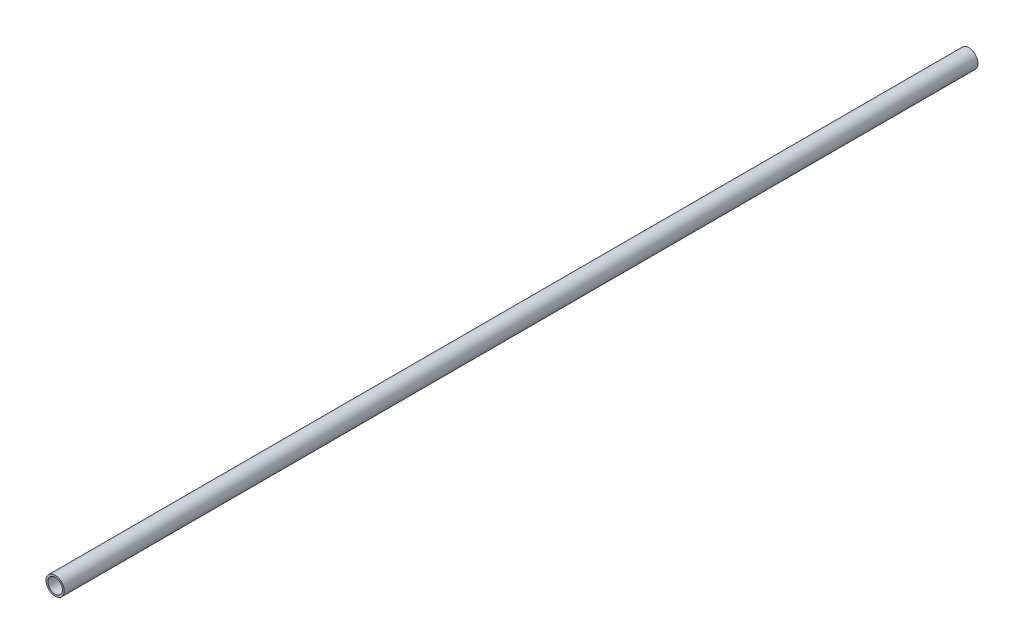
ISO-10303-21;
HEADER;
FILE_DESCRIPTION(('STEP AP214'),'2;1');
FILE_NAME('part.step','',(''),(''),'','','');
FILE_SCHEMA(('AUTOMOTIVE_DESIGN { 1 0 10303 214 1 1 1 1 }'));
ENDSEC;
DATA;
#1=APPLICATION_CONTEXT('core data for automotive mechanical design processes');
#2=APPLICATION_PROTOCOL_DEFINITION('international standard','automotive_design',2000,#1);
#3=PRODUCT_CONTEXT('',#1,'mechanical');
#4=PRODUCT('Part','Part','',(#3));
#5=PRODUCT_RELATED_PRODUCT_CATEGORY('part','',(#4));
#6=PRODUCT_DEFINITION_FORMATION('','',#4);
#7=PRODUCT_DEFINITION_CONTEXT('part definition',#1,'design');
#8=PRODUCT_DEFINITION('design','',#6,#7);
#9=PRODUCT_DEFINITION_SHAPE('','',#8);
#10=(LENGTH_UNIT() NAMED_UNIT(*) SI_UNIT(.MILLI.,.METRE.));
#11=(NAMED_UNIT(*) PLANE_ANGLE_UNIT() SI_UNIT($,.RADIAN.));
#12=(NAMED_UNIT(*) SI_UNIT($,.STERADIAN.) SOLID_ANGLE_UNIT());
#13=UNCERTAINTY_MEASURE_WITH_UNIT(LENGTH_MEASURE(1.E-05),#10,'distance_accuracy_value','');
#14=(GEOMETRIC_REPRESENTATION_CONTEXT(3) GLOBAL_UNCERTAINTY_ASSIGNED_CONTEXT((#13)) GLOBAL_UNIT_ASSIGNED_CONTEXT((#10,
#11,#12)) REPRESENTATION_CONTEXT('',''));
#15=CARTESIAN_POINT('',(0.,0.,0.));
#16=DIRECTION('',(0.,0.,1.));
#17=DIRECTION('',(1.,0.,0.));
#18=AXIS2_PLACEMENT_3D('',#15,#16,#17);
#19=CARTESIAN_POINT('',(0.,0.,2500.));
#20=DIRECTION('',(0.,0.,1.));
#21=DIRECTION('',(1.,0.,0.));
#22=AXIS2_PLACEMENT_3D('',#19,#20,#21);
#23=PLANE('',#22);
#24=CARTESIAN_POINT('',(0.,0.,2500.));
#25=DIRECTION('',(0.,0.,1.));
#26=DIRECTION('',(1.,0.,0.));
#27=AXIS2_PLACEMENT_3D('',#24,#25,#26);
#28=CIRCLE('',#27,25.);
#29=CARTESIAN_POINT('',(25.,0.,2500.));
#30=VERTEX_POINT('',#29);
#31=EDGE_CURVE('E10',#30,#30,#28,.T.);
#32=ORIENTED_EDGE('',*,*,#31,.T.);
#33=EDGE_LOOP('',(#32));
#34=FACE_BOUND('',#33,.T.);
#35=CARTESIAN_POINT('',(0.,0.,2500.));
#36=DIRECTION('',(0.,0.,1.));
#37=DIRECTION('',(1.,0.,0.));
#38=AXIS2_PLACEMENT_3D('',#35,#36,#37);
#39=CIRCLE('',#38,20.);
#40=CARTESIAN_POINT('',(20.,0.,2500.));
#41=VERTEX_POINT('',#40);
#42=EDGE_CURVE('E42',#41,#41,#39,.T.);
#43=ORIENTED_EDGE('',*,*,#42,.F.);
#44=EDGE_LOOP('',(#43));
#45=FACE_BOUND('',#44,.T.);
#46=ADVANCED_FACE('F31',(#34,#45),#23,.T.);
#47=CARTESIAN_POINT('',(0.,0.,0.));
#48=DIRECTION('',(0.,0.,1.));
#49=DIRECTION('',(1.,0.,0.));
#50=AXIS2_PLACEMENT_3D('',#47,#48,#49);
#51=PLANE('',#50);
#52=CARTESIAN_POINT('',(0.,0.,0.));
#53=DIRECTION('',(0.,0.,1.));
#54=DIRECTION('',(1.,0.,0.));
#55=AXIS2_PLACEMENT_3D('',#52,#53,#54);
#56=CIRCLE('',#55,25.);
#57=CARTESIAN_POINT('',(25.,0.,0.));
#58=VERTEX_POINT('',#57);
#59=EDGE_CURVE('E35',#58,#58,#56,.T.);
#60=ORIENTED_EDGE('',*,*,#59,.F.);
#61=EDGE_LOOP('',(#60));
#62=FACE_BOUND('',#61,.T.);
#63=CARTESIAN_POINT('',(0.,0.,0.));
#64=DIRECTION('',(0.,0.,1.));
#65=DIRECTION('',(1.,0.,0.));
#66=AXIS2_PLACEMENT_3D('',#63,#64,#65);
#67=CIRCLE('',#66,20.);
#68=CARTESIAN_POINT('',(20.,0.,0.));
#69=VERTEX_POINT('',#68);
#70=EDGE_CURVE('E44',#69,#69,#67,.T.);
#71=ORIENTED_EDGE('',*,*,#70,.T.);
#72=EDGE_LOOP('',(#71));
#73=FACE_BOUND('',#72,.T.);
#74=ADVANCED_FACE('F54',(#62,#73),#51,.F.);
#75=CARTESIAN_POINT('',(0.,0.,2500.));
#76=DIRECTION('',(0.,0.,-1.));
#77=DIRECTION('',(-1.,0.,0.));
#78=AXIS2_PLACEMENT_3D('',#75,#76,#77);
#79=CYLINDRICAL_SURFACE('',#78,25.);
#80=ORIENTED_EDGE('',*,*,#31,.F.);
#81=EDGE_LOOP('',(#80));
#82=FACE_BOUND('',#81,.T.);
#83=ORIENTED_EDGE('',*,*,#59,.T.);
#84=EDGE_LOOP('',(#83));
#85=FACE_BOUND('',#84,.T.);
#86=ADVANCED_FACE('F33',(#82,#85),#79,.T.);
#87=CARTESIAN_POINT('',(0.,0.,2500.));
#88=DIRECTION('',(0.,0.,-1.));
#89=DIRECTION('',(-1.,0.,0.));
#90=AXIS2_PLACEMENT_3D('',#87,#88,#89);
#91=CYLINDRICAL_SURFACE('',#90,20.);
#92=ORIENTED_EDGE('',*,*,#42,.T.);
#93=EDGE_LOOP('',(#92));
#94=FACE_BOUND('',#93,.T.);
#95=ORIENTED_EDGE('',*,*,#70,.F.);
#96=EDGE_LOOP('',(#95));
#97=FACE_BOUND('',#96,.T.);
#98=ADVANCED_FACE('F50',(#94,#97),#91,.F.);
#99=CLOSED_SHELL('',(#46,#74,#86,#98));
#100=MANIFOLD_SOLID_BREP('B2',#99);
#101=ADVANCED_BREP_SHAPE_REPRESENTATION('',(#18,#100),#14);
#102=SHAPE_DEFINITION_REPRESENTATION(#9,#101);
ENDSEC;
END-ISO-10303-21;
